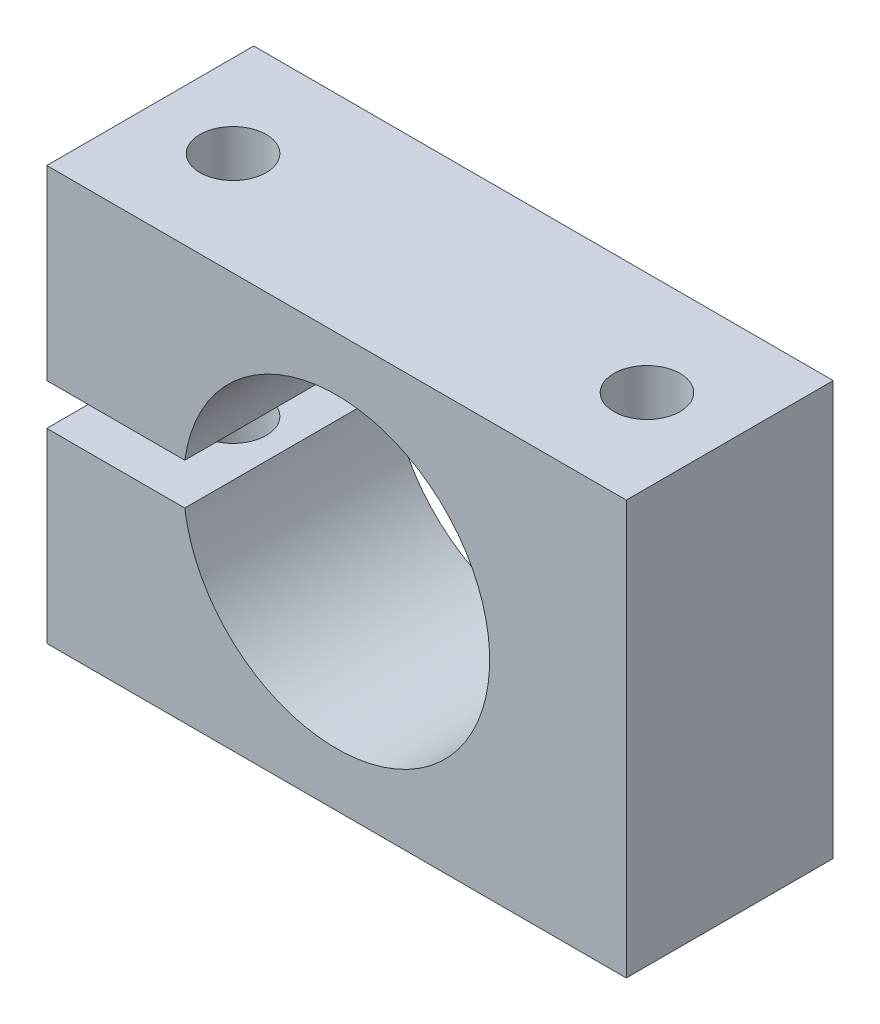
ISO-10303-21;
HEADER;
FILE_DESCRIPTION(('STEP AP214'),'2;1');
FILE_NAME('part.step','',(''),(''),'','','');
FILE_SCHEMA(('AUTOMOTIVE_DESIGN { 1 0 10303 214 1 1 1 1 }'));
ENDSEC;
DATA;
#1=APPLICATION_CONTEXT('core data for automotive mechanical design processes');
#2=APPLICATION_PROTOCOL_DEFINITION('international standard','automotive_design',2000,#1);
#3=PRODUCT_CONTEXT('',#1,'mechanical');
#4=PRODUCT('Part','Part','',(#3));
#5=PRODUCT_RELATED_PRODUCT_CATEGORY('part','',(#4));
#6=PRODUCT_DEFINITION_FORMATION('','',#4);
#7=PRODUCT_DEFINITION_CONTEXT('part definition',#1,'design');
#8=PRODUCT_DEFINITION('design','',#6,#7);
#9=PRODUCT_DEFINITION_SHAPE('','',#8);
#10=(LENGTH_UNIT() NAMED_UNIT(*) SI_UNIT(.MILLI.,.METRE.));
#11=(NAMED_UNIT(*) PLANE_ANGLE_UNIT() SI_UNIT($,.RADIAN.));
#12=(NAMED_UNIT(*) SI_UNIT($,.STERADIAN.) SOLID_ANGLE_UNIT());
#13=UNCERTAINTY_MEASURE_WITH_UNIT(LENGTH_MEASURE(1.E-05),#10,'distance_accuracy_value','');
#14=(GEOMETRIC_REPRESENTATION_CONTEXT(3) GLOBAL_UNCERTAINTY_ASSIGNED_CONTEXT((#13)) GLOBAL_UNIT_ASSIGNED_CONTEXT((#10,
#11,#12)) REPRESENTATION_CONTEXT('',''));
#15=CARTESIAN_POINT('',(0.,0.,0.));
#16=DIRECTION('',(0.,0.,1.));
#17=DIRECTION('',(1.,0.,0.));
#18=AXIS2_PLACEMENT_3D('',#15,#16,#17);
#19=CARTESIAN_POINT('',(-35.,50.,-12.5));
#20=DIRECTION('',(1.,0.,0.));
#21=DIRECTION('',(0.,0.,-1.));
#22=AXIS2_PLACEMENT_3D('',#19,#20,#21);
#23=PLANE('',#22);
#24=DIRECTION('',(0.,0.,1.));
#25=VECTOR('',#24,1.);
#26=CARTESIAN_POINT('',(-35.,27.5,-37.5));
#27=LINE('',#26,#25);
#28=CARTESIAN_POINT('',(-35.,27.5,-12.5));
#29=VERTEX_POINT('',#28);
#30=CARTESIAN_POINT('',(-35.,27.5,12.5));
#31=VERTEX_POINT('',#30);
#32=EDGE_CURVE('E148',#29,#31,#27,.T.);
#33=ORIENTED_EDGE('',*,*,#32,.T.);
#34=DIRECTION('',(0.,-1.,0.));
#35=VECTOR('',#34,1.);
#36=CARTESIAN_POINT('',(-35.,50.,12.5));
#37=LINE('',#36,#35);
#38=CARTESIAN_POINT('',(-35.,50.,12.5));
#39=VERTEX_POINT('',#38);
#40=EDGE_CURVE('E159',#39,#31,#37,.T.);
#41=ORIENTED_EDGE('',*,*,#40,.F.);
#42=DIRECTION('',(0.,0.,1.));
#43=VECTOR('',#42,1.);
#44=CARTESIAN_POINT('',(-35.,50.,-12.5));
#45=LINE('',#44,#43);
#46=CARTESIAN_POINT('',(-35.,50.,-12.5));
#47=VERTEX_POINT('',#46);
#48=EDGE_CURVE('E219',#47,#39,#45,.T.);
#49=ORIENTED_EDGE('',*,*,#48,.F.);
#50=DIRECTION('',(0.,-1.,0.));
#51=VECTOR('',#50,1.);
#52=CARTESIAN_POINT('',(-35.,50.,-12.5));
#53=LINE('',#52,#51);
#54=EDGE_CURVE('E64',#47,#29,#53,.T.);
#55=ORIENTED_EDGE('',*,*,#54,.T.);
#56=EDGE_LOOP('',(#33,#41,#49,#55));
#57=FACE_BOUND('',#56,.T.);
#58=ADVANCED_FACE('F52',(#57),#23,.F.);
#59=CARTESIAN_POINT('',(35.,50.,-12.5));
#60=DIRECTION('',(-1.,0.,0.));
#61=DIRECTION('',(0.,0.,1.));
#62=AXIS2_PLACEMENT_3D('',#59,#60,#61);
#63=PLANE('',#62);
#64=DIRECTION('',(0.,0.,-1.));
#65=VECTOR('',#64,1.);
#66=CARTESIAN_POINT('',(35.,0.,-12.5));
#67=LINE('',#66,#65);
#68=CARTESIAN_POINT('',(35.,0.,12.5));
#69=VERTEX_POINT('',#68);
#70=CARTESIAN_POINT('',(35.,0.,-12.5));
#71=VERTEX_POINT('',#70);
#72=EDGE_CURVE('E238',#69,#71,#67,.T.);
#73=ORIENTED_EDGE('',*,*,#72,.T.);
#74=DIRECTION('',(0.,-1.,0.));
#75=VECTOR('',#74,1.);
#76=CARTESIAN_POINT('',(35.,50.,-12.5));
#77=LINE('',#76,#75);
#78=CARTESIAN_POINT('',(35.,50.,-12.5));
#79=VERTEX_POINT('',#78);
#80=EDGE_CURVE('E13',#79,#71,#77,.T.);
#81=ORIENTED_EDGE('',*,*,#80,.F.);
#82=DIRECTION('',(0.,0.,-1.));
#83=VECTOR('',#82,1.);
#84=CARTESIAN_POINT('',(35.,50.,-12.5));
#85=LINE('',#84,#83);
#86=CARTESIAN_POINT('',(35.,50.,12.5));
#87=VERTEX_POINT('',#86);
#88=EDGE_CURVE('E209',#87,#79,#85,.T.);
#89=ORIENTED_EDGE('',*,*,#88,.F.);
#90=DIRECTION('',(0.,-1.,0.));
#91=VECTOR('',#90,1.);
#92=CARTESIAN_POINT('',(35.,50.,12.5));
#93=LINE('',#92,#91);
#94=EDGE_CURVE('E172',#87,#69,#93,.T.);
#95=ORIENTED_EDGE('',*,*,#94,.T.);
#96=EDGE_LOOP('',(#73,#81,#89,#95));
#97=FACE_BOUND('',#96,.T.);
#98=ADVANCED_FACE('F55',(#97),#63,.F.);
#99=CARTESIAN_POINT('',(-35.,50.,-12.5));
#100=DIRECTION('',(0.,0.,1.));
#101=DIRECTION('',(1.,0.,0.));
#102=AXIS2_PLACEMENT_3D('',#99,#100,#101);
#103=PLANE('',#102);
#104=CARTESIAN_POINT('',(-35.,22.5,-12.5));
#105=VERTEX_POINT('',#104);
#106=CARTESIAN_POINT('',(-35.,0.,-12.5));
#107=VERTEX_POINT('',#106);
#108=EDGE_CURVE('E165',#105,#107,#53,.T.);
#109=ORIENTED_EDGE('',*,*,#108,.F.);
#110=DIRECTION('',(1.,0.,0.));
#111=VECTOR('',#110,1.);
#112=CARTESIAN_POINT('',(-35.,22.5,-12.5));
#113=LINE('',#112,#111);
#114=CARTESIAN_POINT('',(-18.3303027798234,22.5,-12.5));
#115=VERTEX_POINT('',#114);
#116=EDGE_CURVE('E251',#105,#115,#113,.T.);
#117=ORIENTED_EDGE('',*,*,#116,.T.);
#118=CARTESIAN_POINT('',(0.,25.,-12.5));
#119=DIRECTION('',(0.,0.,1.));
#120=DIRECTION('',(1.,0.,0.));
#121=AXIS2_PLACEMENT_3D('',#118,#119,#120);
#122=CIRCLE('',#121,18.5);
#123=CARTESIAN_POINT('',(-18.3303027798234,27.5,-12.5));
#124=VERTEX_POINT('',#123);
#125=EDGE_CURVE('E214',#115,#124,#122,.T.);
#126=ORIENTED_EDGE('',*,*,#125,.T.);
#127=DIRECTION('',(1.,0.,0.));
#128=VECTOR('',#127,1.);
#129=CARTESIAN_POINT('',(-35.,27.5,-12.5));
#130=LINE('',#129,#128);
#131=EDGE_CURVE('E254',#29,#124,#130,.T.);
#132=ORIENTED_EDGE('',*,*,#131,.F.);
#133=ORIENTED_EDGE('',*,*,#54,.F.);
#134=DIRECTION('',(-1.,0.,0.));
#135=VECTOR('',#134,1.);
#136=CARTESIAN_POINT('',(-35.,50.,-12.5));
#137=LINE('',#136,#135);
#138=EDGE_CURVE('E118',#79,#47,#137,.T.);
#139=ORIENTED_EDGE('',*,*,#138,.F.);
#140=ORIENTED_EDGE('',*,*,#80,.T.);
#141=DIRECTION('',(-1.,0.,0.));
#142=VECTOR('',#141,1.);
#143=CARTESIAN_POINT('',(-35.,0.,-12.5));
#144=LINE('',#143,#142);
#145=EDGE_CURVE('E232',#71,#107,#144,.T.);
#146=ORIENTED_EDGE('',*,*,#145,.T.);
#147=EDGE_LOOP('',(#109,#117,#126,#132,#133,#139,#140,#146));
#148=FACE_BOUND('',#147,.T.);
#149=ADVANCED_FACE('F275',(#148),#103,.F.);
#150=CARTESIAN_POINT('',(-35.,22.5,12.5));
#151=VERTEX_POINT('',#150);
#152=CARTESIAN_POINT('',(-35.,0.,12.5));
#153=VERTEX_POINT('',#152);
#154=EDGE_CURVE('E166',#151,#153,#37,.T.);
#155=ORIENTED_EDGE('',*,*,#154,.F.);
#156=DIRECTION('',(0.,0.,1.));
#157=VECTOR('',#156,1.);
#158=CARTESIAN_POINT('',(-35.,22.5,-37.5));
#159=LINE('',#158,#157);
#160=EDGE_CURVE('E161',#105,#151,#159,.T.);
#161=ORIENTED_EDGE('',*,*,#160,.F.);
#162=ORIENTED_EDGE('',*,*,#108,.T.);
#163=DIRECTION('',(0.,0.,1.));
#164=VECTOR('',#163,1.);
#165=CARTESIAN_POINT('',(-35.,0.,-12.5));
#166=LINE('',#165,#164);
#167=EDGE_CURVE('E237',#107,#153,#166,.T.);
#168=ORIENTED_EDGE('',*,*,#167,.T.);
#169=EDGE_LOOP('',(#155,#161,#162,#168));
#170=FACE_BOUND('',#169,.T.);
#171=ADVANCED_FACE('F277',(#170),#23,.F.);
#172=CARTESIAN_POINT('',(-35.,50.,12.5));
#173=DIRECTION('',(0.,0.,-1.));
#174=DIRECTION('',(-1.,0.,0.));
#175=AXIS2_PLACEMENT_3D('',#172,#173,#174);
#176=PLANE('',#175);
#177=CARTESIAN_POINT('',(0.,25.,12.5));
#178=DIRECTION('',(0.,0.,1.));
#179=DIRECTION('',(1.,0.,0.));
#180=AXIS2_PLACEMENT_3D('',#177,#178,#179);
#181=CIRCLE('',#180,18.5);
#182=CARTESIAN_POINT('',(-18.3303027798234,22.5,12.5));
#183=VERTEX_POINT('',#182);
#184=CARTESIAN_POINT('',(-18.3303027798234,27.5,12.5));
#185=VERTEX_POINT('',#184);
#186=EDGE_CURVE('E74',#183,#185,#181,.T.);
#187=ORIENTED_EDGE('',*,*,#186,.F.);
#188=DIRECTION('',(1.,0.,0.));
#189=VECTOR('',#188,1.);
#190=CARTESIAN_POINT('',(0.,22.5,12.5));
#191=LINE('',#190,#189);
#192=EDGE_CURVE('E153',#151,#183,#191,.T.);
#193=ORIENTED_EDGE('',*,*,#192,.F.);
#194=ORIENTED_EDGE('',*,*,#154,.T.);
#195=DIRECTION('',(1.,0.,0.));
#196=VECTOR('',#195,1.);
#197=CARTESIAN_POINT('',(-35.,0.,12.5));
#198=LINE('',#197,#196);
#199=EDGE_CURVE('E109',#153,#69,#198,.T.);
#200=ORIENTED_EDGE('',*,*,#199,.T.);
#201=ORIENTED_EDGE('',*,*,#94,.F.);
#202=DIRECTION('',(1.,0.,0.));
#203=VECTOR('',#202,1.);
#204=CARTESIAN_POINT('',(-35.,50.,12.5));
#205=LINE('',#204,#203);
#206=EDGE_CURVE('E84',#39,#87,#205,.T.);
#207=ORIENTED_EDGE('',*,*,#206,.F.);
#208=ORIENTED_EDGE('',*,*,#40,.T.);
#209=DIRECTION('',(1.,0.,0.));
#210=VECTOR('',#209,1.);
#211=CARTESIAN_POINT('',(0.,27.5,12.5));
#212=LINE('',#211,#210);
#213=EDGE_CURVE('E145',#31,#185,#212,.T.);
#214=ORIENTED_EDGE('',*,*,#213,.T.);
#215=EDGE_LOOP('',(#187,#193,#194,#200,#201,#207,#208,#214));
#216=FACE_BOUND('',#215,.T.);
#217=ADVANCED_FACE('F163',(#216),#176,.F.);
#218=CARTESIAN_POINT('',(0.,50.,0.));
#219=DIRECTION('',(0.,1.,0.));
#220=DIRECTION('',(0.,0.,1.));
#221=AXIS2_PLACEMENT_3D('',#218,#219,#220);
#222=PLANE('',#221);
#223=CARTESIAN_POINT('',(25.,50.,0.));
#224=DIRECTION('',(0.,-1.,0.));
#225=DIRECTION('',(0.,0.,-1.));
#226=AXIS2_PLACEMENT_3D('',#223,#224,#225);
#227=CIRCLE('',#226,4.);
#228=CARTESIAN_POINT('',(25.,50.,-3.99999999999999));
#229=VERTEX_POINT('',#228);
#230=EDGE_CURVE('E192',#229,#229,#227,.T.);
#231=ORIENTED_EDGE('',*,*,#230,.T.);
#232=EDGE_LOOP('',(#231));
#233=FACE_BOUND('',#232,.T.);
#234=CARTESIAN_POINT('',(-25.,50.,0.));
#235=DIRECTION('',(0.,-1.,0.));
#236=DIRECTION('',(0.,0.,-1.));
#237=AXIS2_PLACEMENT_3D('',#234,#235,#236);
#238=CIRCLE('',#237,4.);
#239=CARTESIAN_POINT('',(-25.,50.,-4.));
#240=VERTEX_POINT('',#239);
#241=EDGE_CURVE('E194',#240,#240,#238,.T.);
#242=ORIENTED_EDGE('',*,*,#241,.T.);
#243=EDGE_LOOP('',(#242));
#244=FACE_BOUND('',#243,.T.);
#245=ORIENTED_EDGE('',*,*,#88,.T.);
#246=ORIENTED_EDGE('',*,*,#138,.T.);
#247=ORIENTED_EDGE('',*,*,#48,.T.);
#248=ORIENTED_EDGE('',*,*,#206,.T.);
#249=EDGE_LOOP('',(#245,#246,#247,#248));
#250=FACE_BOUND('',#249,.T.);
#251=ADVANCED_FACE('F296',(#233,#244,#250),#222,.T.);
#252=CARTESIAN_POINT('',(0.,0.,0.));
#253=DIRECTION('',(0.,1.,0.));
#254=DIRECTION('',(0.,0.,1.));
#255=AXIS2_PLACEMENT_3D('',#252,#253,#254);
#256=PLANE('',#255);
#257=CARTESIAN_POINT('',(25.,0.,0.));
#258=DIRECTION('',(0.,-1.,0.));
#259=DIRECTION('',(0.,0.,-1.));
#260=AXIS2_PLACEMENT_3D('',#257,#258,#259);
#261=CIRCLE('',#260,4.);
#262=CARTESIAN_POINT('',(25.,0.,-3.99999999999999));
#263=VERTEX_POINT('',#262);
#264=EDGE_CURVE('E186',#263,#263,#261,.T.);
#265=ORIENTED_EDGE('',*,*,#264,.F.);
#266=EDGE_LOOP('',(#265));
#267=FACE_BOUND('',#266,.T.);
#268=CARTESIAN_POINT('',(-25.,0.,0.));
#269=DIRECTION('',(0.,-1.,0.));
#270=DIRECTION('',(0.,0.,-1.));
#271=AXIS2_PLACEMENT_3D('',#268,#269,#270);
#272=CIRCLE('',#271,4.);
#273=CARTESIAN_POINT('',(-25.,0.,-4.));
#274=VERTEX_POINT('',#273);
#275=EDGE_CURVE('E198',#274,#274,#272,.T.);
#276=ORIENTED_EDGE('',*,*,#275,.F.);
#277=EDGE_LOOP('',(#276));
#278=FACE_BOUND('',#277,.T.);
#279=ORIENTED_EDGE('',*,*,#72,.F.);
#280=ORIENTED_EDGE('',*,*,#199,.F.);
#281=ORIENTED_EDGE('',*,*,#167,.F.);
#282=ORIENTED_EDGE('',*,*,#145,.F.);
#283=EDGE_LOOP('',(#279,#280,#281,#282));
#284=FACE_BOUND('',#283,.T.);
#285=ADVANCED_FACE('F272',(#267,#278,#284),#256,.F.);
#286=CARTESIAN_POINT('',(0.,25.,-37.5));
#287=DIRECTION('',(0.,0.,1.));
#288=DIRECTION('',(1.,0.,0.));
#289=AXIS2_PLACEMENT_3D('',#286,#287,#288);
#290=CYLINDRICAL_SURFACE('',#289,18.5);
#291=DIRECTION('',(0.,0.,1.));
#292=VECTOR('',#291,1.);
#293=CARTESIAN_POINT('',(-18.3303027798234,22.5,-37.5));
#294=LINE('',#293,#292);
#295=EDGE_CURVE('E257',#115,#183,#294,.T.);
#296=ORIENTED_EDGE('',*,*,#295,.T.);
#297=ORIENTED_EDGE('',*,*,#186,.T.);
#298=DIRECTION('',(0.,0.,1.));
#299=VECTOR('',#298,1.);
#300=CARTESIAN_POINT('',(-18.3303027798234,27.5,-37.5));
#301=LINE('',#300,#299);
#302=EDGE_CURVE('E150',#124,#185,#301,.T.);
#303=ORIENTED_EDGE('',*,*,#302,.F.);
#304=ORIENTED_EDGE('',*,*,#125,.F.);
#305=EDGE_LOOP('',(#296,#297,#303,#304));
#306=FACE_BOUND('',#305,.T.);
#307=ADVANCED_FACE('F299',(#306),#290,.F.);
#308=CARTESIAN_POINT('',(0.,22.5,-37.5));
#309=DIRECTION('',(0.,-1.,0.));
#310=DIRECTION('',(0.,0.,-1.));
#311=AXIS2_PLACEMENT_3D('',#308,#309,#310);
#312=PLANE('',#311);
#313=CARTESIAN_POINT('',(-25.,22.5,0.));
#314=DIRECTION('',(0.,-1.,0.));
#315=DIRECTION('',(0.,0.,-1.));
#316=AXIS2_PLACEMENT_3D('',#313,#314,#315);
#317=CIRCLE('',#316,4.);
#318=CARTESIAN_POINT('',(-25.,22.5,-4.));
#319=VERTEX_POINT('',#318);
#320=EDGE_CURVE('E259',#319,#319,#317,.T.);
#321=ORIENTED_EDGE('',*,*,#320,.T.);
#322=EDGE_LOOP('',(#321));
#323=FACE_BOUND('',#322,.T.);
#324=ORIENTED_EDGE('',*,*,#160,.T.);
#325=ORIENTED_EDGE('',*,*,#192,.T.);
#326=ORIENTED_EDGE('',*,*,#295,.F.);
#327=ORIENTED_EDGE('',*,*,#116,.F.);
#328=EDGE_LOOP('',(#324,#325,#326,#327));
#329=FACE_BOUND('',#328,.T.);
#330=ADVANCED_FACE('F308',(#323,#329),#312,.F.);
#331=CARTESIAN_POINT('',(0.,27.5,-37.5));
#332=DIRECTION('',(0.,-1.,0.));
#333=DIRECTION('',(0.,0.,-1.));
#334=AXIS2_PLACEMENT_3D('',#331,#332,#333);
#335=PLANE('',#334);
#336=CARTESIAN_POINT('',(-25.,27.5,0.));
#337=DIRECTION('',(0.,-1.,0.));
#338=DIRECTION('',(0.,0.,-1.));
#339=AXIS2_PLACEMENT_3D('',#336,#337,#338);
#340=CIRCLE('',#339,4.);
#341=CARTESIAN_POINT('',(-25.,27.5,-4.));
#342=VERTEX_POINT('',#341);
#343=EDGE_CURVE('E57',#342,#342,#340,.T.);
#344=ORIENTED_EDGE('',*,*,#343,.F.);
#345=EDGE_LOOP('',(#344));
#346=FACE_BOUND('',#345,.T.);
#347=ORIENTED_EDGE('',*,*,#131,.T.);
#348=ORIENTED_EDGE('',*,*,#302,.T.);
#349=ORIENTED_EDGE('',*,*,#213,.F.);
#350=ORIENTED_EDGE('',*,*,#32,.F.);
#351=EDGE_LOOP('',(#347,#348,#349,#350));
#352=FACE_BOUND('',#351,.T.);
#353=ADVANCED_FACE('F147',(#346,#352),#335,.T.);
#354=CARTESIAN_POINT('',(-25.,50.,0.));
#355=DIRECTION('',(0.,-1.,0.));
#356=DIRECTION('',(0.,0.,-1.));
#357=AXIS2_PLACEMENT_3D('',#354,#355,#356);
#358=CYLINDRICAL_SURFACE('',#357,4.);
#359=ORIENTED_EDGE('',*,*,#343,.T.);
#360=EDGE_LOOP('',(#359));
#361=FACE_BOUND('',#360,.T.);
#362=ORIENTED_EDGE('',*,*,#241,.F.);
#363=EDGE_LOOP('',(#362));
#364=FACE_BOUND('',#363,.T.);
#365=ADVANCED_FACE('F312',(#361,#364),#358,.F.);
#366=ORIENTED_EDGE('',*,*,#275,.T.);
#367=EDGE_LOOP('',(#366));
#368=FACE_BOUND('',#367,.T.);
#369=ORIENTED_EDGE('',*,*,#320,.F.);
#370=EDGE_LOOP('',(#369));
#371=FACE_BOUND('',#370,.T.);
#372=ADVANCED_FACE('F320',(#368,#371),#358,.F.);
#373=CARTESIAN_POINT('',(25.,50.,0.));
#374=DIRECTION('',(0.,-1.,0.));
#375=DIRECTION('',(0.,0.,-1.));
#376=AXIS2_PLACEMENT_3D('',#373,#374,#375);
#377=CYLINDRICAL_SURFACE('',#376,4.);
#378=ORIENTED_EDGE('',*,*,#230,.F.);
#379=EDGE_LOOP('',(#378));
#380=FACE_BOUND('',#379,.T.);
#381=ORIENTED_EDGE('',*,*,#264,.T.);
#382=EDGE_LOOP('',(#381));
#383=FACE_BOUND('',#382,.T.);
#384=ADVANCED_FACE('F322',(#380,#383),#377,.F.);
#385=CLOSED_SHELL('',(#58,#98,#149,#171,#217,#251,#285,#307,#330,#353,#365,#372,#384));
#386=MANIFOLD_SOLID_BREP('B2',#385);
#387=ADVANCED_BREP_SHAPE_REPRESENTATION('',(#18,#386),#14);
#388=SHAPE_DEFINITION_REPRESENTATION(#9,#387);
ENDSEC;
END-ISO-10303-21;
